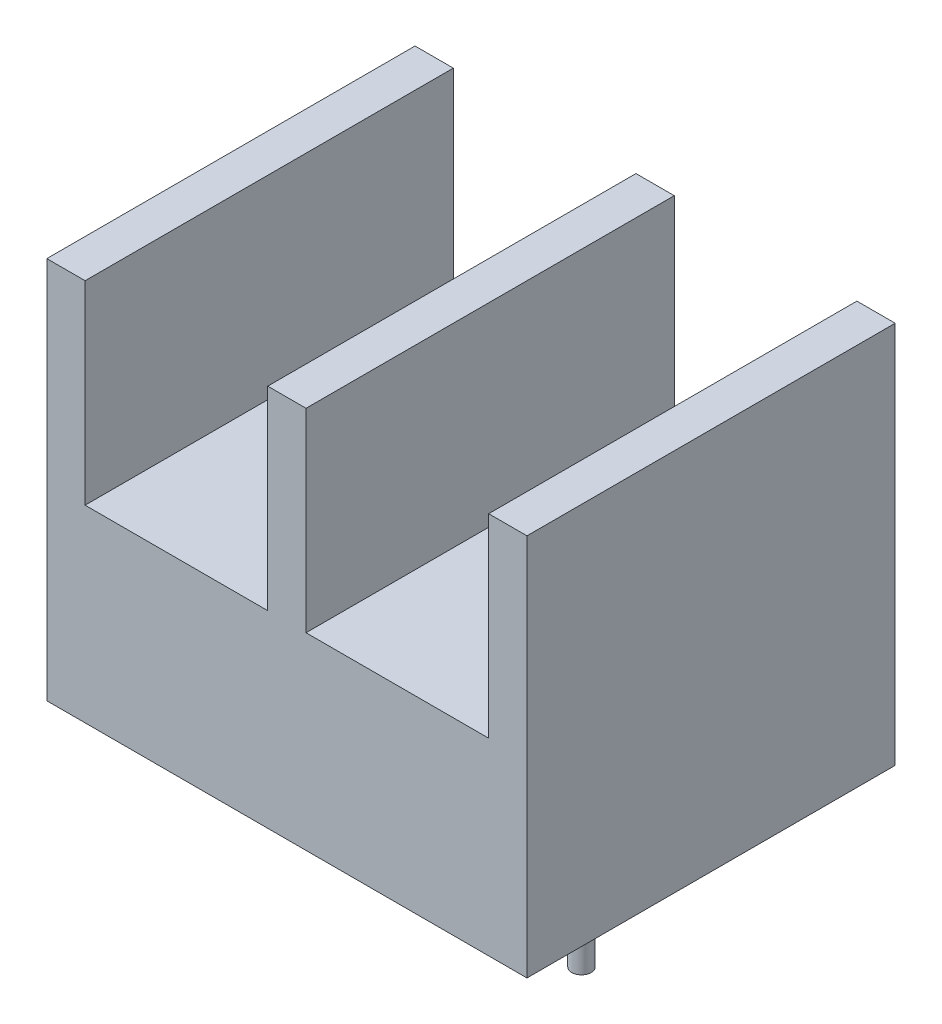
ISO-10303-21;
HEADER;
FILE_DESCRIPTION(('STEP AP214'),'2;1');
FILE_NAME('part.step','',(''),(''),'','','');
FILE_SCHEMA(('AUTOMOTIVE_DESIGN { 1 0 10303 214 1 1 1 1 }'));
ENDSEC;
DATA;
#1=APPLICATION_CONTEXT('core data for automotive mechanical design processes');
#2=APPLICATION_PROTOCOL_DEFINITION('international standard','automotive_design',2000,#1);
#3=PRODUCT_CONTEXT('',#1,'mechanical');
#4=PRODUCT('Part','Part','',(#3));
#5=PRODUCT_RELATED_PRODUCT_CATEGORY('part','',(#4));
#6=PRODUCT_DEFINITION_FORMATION('','',#4);
#7=PRODUCT_DEFINITION_CONTEXT('part definition',#1,'design');
#8=PRODUCT_DEFINITION('design','',#6,#7);
#9=PRODUCT_DEFINITION_SHAPE('','',#8);
#10=(LENGTH_UNIT() NAMED_UNIT(*) SI_UNIT(.MILLI.,.METRE.));
#11=(NAMED_UNIT(*) PLANE_ANGLE_UNIT() SI_UNIT($,.RADIAN.));
#12=(NAMED_UNIT(*) SI_UNIT($,.STERADIAN.) SOLID_ANGLE_UNIT());
#13=UNCERTAINTY_MEASURE_WITH_UNIT(LENGTH_MEASURE(1.E-05),#10,'distance_accuracy_value','');
#14=(GEOMETRIC_REPRESENTATION_CONTEXT(3) GLOBAL_UNCERTAINTY_ASSIGNED_CONTEXT((#13)) GLOBAL_UNIT_ASSIGNED_CONTEXT((#10,
#11,#12)) REPRESENTATION_CONTEXT('',''));
#15=CARTESIAN_POINT('',(0.,0.,0.));
#16=DIRECTION('',(0.,0.,1.));
#17=DIRECTION('',(1.,0.,0.));
#18=AXIS2_PLACEMENT_3D('',#15,#16,#17);
#19=CARTESIAN_POINT('',(0.,16.51,0.));
#20=DIRECTION('',(0.,-1.,0.));
#21=DIRECTION('',(0.,0.,-1.));
#22=AXIS2_PLACEMENT_3D('',#19,#20,#21);
#23=PLANE('',#22);
#24=DIRECTION('',(-1.,0.,0.));
#25=VECTOR('',#24,1.);
#26=CARTESIAN_POINT('',(-10.3505,16.51,-7.9375));
#27=LINE('',#26,#25);
#28=CARTESIAN_POINT('',(10.3505,16.51,-7.9375));
#29=VERTEX_POINT('',#28);
#30=CARTESIAN_POINT('',(8.69950000000003,16.51,-7.9375));
#31=VERTEX_POINT('',#30);
#32=EDGE_CURVE('E202',#29,#31,#27,.T.);
#33=ORIENTED_EDGE('',*,*,#32,.T.);
#34=DIRECTION('',(0.,0.,-1.));
#35=VECTOR('',#34,1.);
#36=CARTESIAN_POINT('',(8.69950000000003,16.51,7.9375));
#37=LINE('',#36,#35);
#38=CARTESIAN_POINT('',(8.69950000000003,16.51,7.9375));
#39=VERTEX_POINT('',#38);
#40=EDGE_CURVE('E156',#39,#31,#37,.T.);
#41=ORIENTED_EDGE('',*,*,#40,.F.);
#42=DIRECTION('',(1.,0.,0.));
#43=VECTOR('',#42,1.);
#44=CARTESIAN_POINT('',(-10.3505,16.51,7.9375));
#45=LINE('',#44,#43);
#46=CARTESIAN_POINT('',(10.3505,16.51,7.9375));
#47=VERTEX_POINT('',#46);
#48=EDGE_CURVE('E147',#39,#47,#45,.T.);
#49=ORIENTED_EDGE('',*,*,#48,.T.);
#50=DIRECTION('',(0.,0.,-1.));
#51=VECTOR('',#50,1.);
#52=CARTESIAN_POINT('',(10.3505,16.51,7.9375));
#53=LINE('',#52,#51);
#54=EDGE_CURVE('E197',#47,#29,#53,.T.);
#55=ORIENTED_EDGE('',*,*,#54,.T.);
#56=EDGE_LOOP('',(#33,#41,#49,#55));
#57=FACE_BOUND('',#56,.T.);
#58=ADVANCED_FACE('F35',(#57),#23,.F.);
#59=CARTESIAN_POINT('',(-0.825499999999989,16.51,7.9375));
#60=VERTEX_POINT('',#59);
#61=CARTESIAN_POINT('',(0.825499999999989,16.51,7.9375));
#62=VERTEX_POINT('',#61);
#63=EDGE_CURVE('E212',#60,#62,#45,.T.);
#64=ORIENTED_EDGE('',*,*,#63,.T.);
#65=DIRECTION('',(0.,0.,-1.));
#66=VECTOR('',#65,1.);
#67=CARTESIAN_POINT('',(0.825499999999989,16.51,7.9375));
#68=LINE('',#67,#66);
#69=CARTESIAN_POINT('',(0.825499999999989,16.51,-7.9375));
#70=VERTEX_POINT('',#69);
#71=EDGE_CURVE('E159',#62,#70,#68,.T.);
#72=ORIENTED_EDGE('',*,*,#71,.T.);
#73=CARTESIAN_POINT('',(-0.825499999999989,16.51,-7.9375));
#74=VERTEX_POINT('',#73);
#75=EDGE_CURVE('E206',#70,#74,#27,.T.);
#76=ORIENTED_EDGE('',*,*,#75,.T.);
#77=DIRECTION('',(0.,0.,-1.));
#78=VECTOR('',#77,1.);
#79=CARTESIAN_POINT('',(-0.825499999999989,16.51,7.9375));
#80=LINE('',#79,#78);
#81=EDGE_CURVE('E154',#60,#74,#80,.T.);
#82=ORIENTED_EDGE('',*,*,#81,.F.);
#83=EDGE_LOOP('',(#64,#72,#76,#82));
#84=FACE_BOUND('',#83,.T.);
#85=ADVANCED_FACE('F246',(#84),#23,.F.);
#86=CARTESIAN_POINT('',(10.3505,16.51,7.9375));
#87=DIRECTION('',(-1.,0.,0.));
#88=DIRECTION('',(0.,0.,1.));
#89=AXIS2_PLACEMENT_3D('',#86,#87,#88);
#90=PLANE('',#89);
#91=DIRECTION('',(0.,0.,-1.));
#92=VECTOR('',#91,1.);
#93=CARTESIAN_POINT('',(10.3505,0.,7.9375));
#94=LINE('',#93,#92);
#95=CARTESIAN_POINT('',(10.3505,0.,7.9375));
#96=VERTEX_POINT('',#95);
#97=CARTESIAN_POINT('',(10.3505,0.,-7.9375));
#98=VERTEX_POINT('',#97);
#99=EDGE_CURVE('E194',#96,#98,#94,.T.);
#100=ORIENTED_EDGE('',*,*,#99,.T.);
#101=DIRECTION('',(0.,-1.,0.));
#102=VECTOR('',#101,1.);
#103=CARTESIAN_POINT('',(10.3505,16.51,-7.9375));
#104=LINE('',#103,#102);
#105=EDGE_CURVE('E11',#29,#98,#104,.T.);
#106=ORIENTED_EDGE('',*,*,#105,.F.);
#107=ORIENTED_EDGE('',*,*,#54,.F.);
#108=DIRECTION('',(0.,-1.,0.));
#109=VECTOR('',#108,1.);
#110=CARTESIAN_POINT('',(10.3505,16.51,7.9375));
#111=LINE('',#110,#109);
#112=EDGE_CURVE('E211',#47,#96,#111,.T.);
#113=ORIENTED_EDGE('',*,*,#112,.T.);
#114=EDGE_LOOP('',(#100,#106,#107,#113));
#115=FACE_BOUND('',#114,.T.);
#116=ADVANCED_FACE('F37',(#115),#90,.F.);
#117=CARTESIAN_POINT('',(-10.3505,16.51,-7.9375));
#118=DIRECTION('',(0.,0.,1.));
#119=DIRECTION('',(1.,0.,0.));
#120=AXIS2_PLACEMENT_3D('',#117,#118,#119);
#121=PLANE('',#120);
#122=DIRECTION('',(-1.,0.,0.));
#123=VECTOR('',#122,1.);
#124=CARTESIAN_POINT('',(8.69950000000002,8.128,-7.9375));
#125=LINE('',#124,#123);
#126=CARTESIAN_POINT('',(8.69950000000002,8.128,-7.9375));
#127=VERTEX_POINT('',#126);
#128=CARTESIAN_POINT('',(0.825499999999991,8.12800000000001,-7.9375));
#129=VERTEX_POINT('',#128);
#130=EDGE_CURVE('E149',#127,#129,#125,.T.);
#131=ORIENTED_EDGE('',*,*,#130,.F.);
#132=DIRECTION('',(0.,-1.,0.));
#133=VECTOR('',#132,1.);
#134=CARTESIAN_POINT('',(8.69950000000003,16.51,-7.9375));
#135=LINE('',#134,#133);
#136=EDGE_CURVE('E130',#31,#127,#135,.T.);
#137=ORIENTED_EDGE('',*,*,#136,.F.);
#138=ORIENTED_EDGE('',*,*,#32,.F.);
#139=ORIENTED_EDGE('',*,*,#105,.T.);
#140=DIRECTION('',(-1.,0.,0.));
#141=VECTOR('',#140,1.);
#142=CARTESIAN_POINT('',(-10.3505,0.,-7.9375));
#143=LINE('',#142,#141);
#144=CARTESIAN_POINT('',(-10.3505,0.,-7.9375));
#145=VERTEX_POINT('',#144);
#146=EDGE_CURVE('E215',#98,#145,#143,.T.);
#147=ORIENTED_EDGE('',*,*,#146,.T.);
#148=DIRECTION('',(0.,-1.,0.));
#149=VECTOR('',#148,1.);
#150=CARTESIAN_POINT('',(-10.3505,16.51,-7.9375));
#151=LINE('',#150,#149);
#152=CARTESIAN_POINT('',(-10.3505,16.51,-7.9375));
#153=VERTEX_POINT('',#152);
#154=EDGE_CURVE('E43',#153,#145,#151,.T.);
#155=ORIENTED_EDGE('',*,*,#154,.F.);
#156=CARTESIAN_POINT('',(-8.69949999999999,16.51,-7.9375));
#157=VERTEX_POINT('',#156);
#158=EDGE_CURVE('E200',#157,#153,#27,.T.);
#159=ORIENTED_EDGE('',*,*,#158,.F.);
#160=DIRECTION('',(0.,1.,0.));
#161=VECTOR('',#160,1.);
#162=CARTESIAN_POINT('',(-8.69949999999999,16.51,-7.9375));
#163=LINE('',#162,#161);
#164=CARTESIAN_POINT('',(-8.69949999999999,8.128,-7.9375));
#165=VERTEX_POINT('',#164);
#166=EDGE_CURVE('E50',#165,#157,#163,.T.);
#167=ORIENTED_EDGE('',*,*,#166,.F.);
#168=DIRECTION('',(-1.,0.,0.));
#169=VECTOR('',#168,1.);
#170=CARTESIAN_POINT('',(-0.825499999999993,8.12800000000001,-7.9375));
#171=LINE('',#170,#169);
#172=CARTESIAN_POINT('',(-0.825499999999993,8.12800000000001,-7.9375));
#173=VERTEX_POINT('',#172);
#174=EDGE_CURVE('E175',#173,#165,#171,.T.);
#175=ORIENTED_EDGE('',*,*,#174,.F.);
#176=DIRECTION('',(0.,-1.,0.));
#177=VECTOR('',#176,1.);
#178=CARTESIAN_POINT('',(-0.825499999999989,16.51,-7.9375));
#179=LINE('',#178,#177);
#180=EDGE_CURVE('E172',#74,#173,#179,.T.);
#181=ORIENTED_EDGE('',*,*,#180,.F.);
#182=ORIENTED_EDGE('',*,*,#75,.F.);
#183=DIRECTION('',(0.,1.,0.));
#184=VECTOR('',#183,1.);
#185=CARTESIAN_POINT('',(0.825499999999989,16.51,-7.9375));
#186=LINE('',#185,#184);
#187=EDGE_CURVE('E58',#129,#70,#186,.T.);
#188=ORIENTED_EDGE('',*,*,#187,.F.);
#189=EDGE_LOOP('',(#131,#137,#138,#139,#147,#155,#159,#167,#175,#181,#182,#188));
#190=FACE_BOUND('',#189,.T.);
#191=ADVANCED_FACE('F250',(#190),#121,.F.);
#192=CARTESIAN_POINT('',(-10.3505,16.51,7.9375));
#193=DIRECTION('',(1.,0.,0.));
#194=DIRECTION('',(0.,0.,-1.));
#195=AXIS2_PLACEMENT_3D('',#192,#193,#194);
#196=PLANE('',#195);
#197=DIRECTION('',(0.,0.,1.));
#198=VECTOR('',#197,1.);
#199=CARTESIAN_POINT('',(-10.3505,0.,7.9375));
#200=LINE('',#199,#198);
#201=CARTESIAN_POINT('',(-10.3505,0.,7.9375));
#202=VERTEX_POINT('',#201);
#203=EDGE_CURVE('E217',#145,#202,#200,.T.);
#204=ORIENTED_EDGE('',*,*,#203,.T.);
#205=DIRECTION('',(0.,-1.,0.));
#206=VECTOR('',#205,1.);
#207=CARTESIAN_POINT('',(-10.3505,16.51,7.9375));
#208=LINE('',#207,#206);
#209=CARTESIAN_POINT('',(-10.3505,16.51,7.9375));
#210=VERTEX_POINT('',#209);
#211=EDGE_CURVE('E222',#210,#202,#208,.T.);
#212=ORIENTED_EDGE('',*,*,#211,.F.);
#213=DIRECTION('',(0.,0.,1.));
#214=VECTOR('',#213,1.);
#215=CARTESIAN_POINT('',(-10.3505,16.51,7.9375));
#216=LINE('',#215,#214);
#217=EDGE_CURVE('E205',#153,#210,#216,.T.);
#218=ORIENTED_EDGE('',*,*,#217,.F.);
#219=ORIENTED_EDGE('',*,*,#154,.T.);
#220=EDGE_LOOP('',(#204,#212,#218,#219));
#221=FACE_BOUND('',#220,.T.);
#222=ADVANCED_FACE('F229',(#221),#196,.F.);
#223=CARTESIAN_POINT('',(-10.3505,16.51,7.9375));
#224=DIRECTION('',(0.,0.,-1.));
#225=DIRECTION('',(-1.,0.,0.));
#226=AXIS2_PLACEMENT_3D('',#223,#224,#225);
#227=PLANE('',#226);
#228=ORIENTED_EDGE('',*,*,#48,.F.);
#229=DIRECTION('',(0.,-1.,0.));
#230=VECTOR('',#229,1.);
#231=CARTESIAN_POINT('',(8.69950000000003,16.51,7.9375));
#232=LINE('',#231,#230);
#233=CARTESIAN_POINT('',(8.69950000000002,8.128,7.9375));
#234=VERTEX_POINT('',#233);
#235=EDGE_CURVE('E127',#39,#234,#232,.T.);
#236=ORIENTED_EDGE('',*,*,#235,.T.);
#237=DIRECTION('',(-1.,0.,0.));
#238=VECTOR('',#237,1.);
#239=CARTESIAN_POINT('',(8.69950000000002,8.128,7.9375));
#240=LINE('',#239,#238);
#241=CARTESIAN_POINT('',(0.825499999999991,8.12800000000001,7.9375));
#242=VERTEX_POINT('',#241);
#243=EDGE_CURVE('E138',#234,#242,#240,.T.);
#244=ORIENTED_EDGE('',*,*,#243,.T.);
#245=DIRECTION('',(0.,1.,0.));
#246=VECTOR('',#245,1.);
#247=CARTESIAN_POINT('',(0.825499999999989,16.51,7.9375));
#248=LINE('',#247,#246);
#249=EDGE_CURVE('E135',#242,#62,#248,.T.);
#250=ORIENTED_EDGE('',*,*,#249,.T.);
#251=ORIENTED_EDGE('',*,*,#63,.F.);
#252=DIRECTION('',(0.,-1.,0.));
#253=VECTOR('',#252,1.);
#254=CARTESIAN_POINT('',(-0.825499999999989,16.51,7.9375));
#255=LINE('',#254,#253);
#256=CARTESIAN_POINT('',(-0.825499999999993,8.12800000000001,7.9375));
#257=VERTEX_POINT('',#256);
#258=EDGE_CURVE('E162',#60,#257,#255,.T.);
#259=ORIENTED_EDGE('',*,*,#258,.T.);
#260=DIRECTION('',(-1.,0.,0.));
#261=VECTOR('',#260,1.);
#262=CARTESIAN_POINT('',(-0.825499999999993,8.12800000000001,7.9375));
#263=LINE('',#262,#261);
#264=CARTESIAN_POINT('',(-8.69949999999999,8.128,7.9375));
#265=VERTEX_POINT('',#264);
#266=EDGE_CURVE('E165',#257,#265,#263,.T.);
#267=ORIENTED_EDGE('',*,*,#266,.T.);
#268=DIRECTION('',(0.,1.,0.));
#269=VECTOR('',#268,1.);
#270=CARTESIAN_POINT('',(-8.69949999999999,16.51,7.9375));
#271=LINE('',#270,#269);
#272=CARTESIAN_POINT('',(-8.69949999999999,16.51,7.9375));
#273=VERTEX_POINT('',#272);
#274=EDGE_CURVE('E168',#265,#273,#271,.T.);
#275=ORIENTED_EDGE('',*,*,#274,.T.);
#276=EDGE_CURVE('E208',#210,#273,#45,.T.);
#277=ORIENTED_EDGE('',*,*,#276,.F.);
#278=ORIENTED_EDGE('',*,*,#211,.T.);
#279=DIRECTION('',(1.,0.,0.));
#280=VECTOR('',#279,1.);
#281=CARTESIAN_POINT('',(-10.3505,0.,7.9375));
#282=LINE('',#281,#280);
#283=EDGE_CURVE('E201',#202,#96,#282,.T.);
#284=ORIENTED_EDGE('',*,*,#283,.T.);
#285=ORIENTED_EDGE('',*,*,#112,.F.);
#286=EDGE_LOOP('',(#228,#236,#244,#250,#251,#259,#267,#275,#277,#278,#284,#285));
#287=FACE_BOUND('',#286,.T.);
#288=ADVANCED_FACE('F145',(#287),#227,.F.);
#289=ORIENTED_EDGE('',*,*,#276,.T.);
#290=DIRECTION('',(0.,0.,-1.));
#291=VECTOR('',#290,1.);
#292=CARTESIAN_POINT('',(-8.69949999999999,16.51,7.9375));
#293=LINE('',#292,#291);
#294=EDGE_CURVE('E180',#273,#157,#293,.T.);
#295=ORIENTED_EDGE('',*,*,#294,.T.);
#296=ORIENTED_EDGE('',*,*,#158,.T.);
#297=ORIENTED_EDGE('',*,*,#217,.T.);
#298=EDGE_LOOP('',(#289,#295,#296,#297));
#299=FACE_BOUND('',#298,.T.);
#300=ADVANCED_FACE('F254',(#299),#23,.F.);
#301=CARTESIAN_POINT('',(0.,0.,0.));
#302=DIRECTION('',(0.,-1.,0.));
#303=DIRECTION('',(0.,0.,-1.));
#304=AXIS2_PLACEMENT_3D('',#301,#302,#303);
#305=PLANE('',#304);
#306=CARTESIAN_POINT('',(-4.7625,0.,0.));
#307=DIRECTION('',(0.,-1.,0.));
#308=DIRECTION('',(0.,0.,-1.));
#309=AXIS2_PLACEMENT_3D('',#306,#307,#308);
#310=CIRCLE('',#309,0.4191);
#311=CARTESIAN_POINT('',(-4.7625,0.,-0.4191));
#312=VERTEX_POINT('',#311);
#313=EDGE_CURVE('E158',#312,#312,#310,.T.);
#314=ORIENTED_EDGE('',*,*,#313,.F.);
#315=EDGE_LOOP('',(#314));
#316=FACE_BOUND('',#315,.T.);
#317=CARTESIAN_POINT('',(4.7625,0.,0.));
#318=DIRECTION('',(0.,-1.,0.));
#319=DIRECTION('',(0.,0.,-1.));
#320=AXIS2_PLACEMENT_3D('',#317,#318,#319);
#321=CIRCLE('',#320,0.4191);
#322=CARTESIAN_POINT('',(4.7625,0.,-0.4191));
#323=VERTEX_POINT('',#322);
#324=EDGE_CURVE('E188',#323,#323,#321,.T.);
#325=ORIENTED_EDGE('',*,*,#324,.F.);
#326=EDGE_LOOP('',(#325));
#327=FACE_BOUND('',#326,.T.);
#328=ORIENTED_EDGE('',*,*,#99,.F.);
#329=ORIENTED_EDGE('',*,*,#283,.F.);
#330=ORIENTED_EDGE('',*,*,#203,.F.);
#331=ORIENTED_EDGE('',*,*,#146,.F.);
#332=EDGE_LOOP('',(#328,#329,#330,#331));
#333=FACE_BOUND('',#332,.T.);
#334=ADVANCED_FACE('F236',(#316,#327,#333),#305,.T.);
#335=CARTESIAN_POINT('',(4.7625,-6.35,0.));
#336=DIRECTION('',(0.,1.,0.));
#337=DIRECTION('',(0.,0.,1.));
#338=AXIS2_PLACEMENT_3D('',#335,#336,#337);
#339=CYLINDRICAL_SURFACE('',#338,0.4191);
#340=CARTESIAN_POINT('',(4.7625,-6.35,0.));
#341=DIRECTION('',(0.,-1.,0.));
#342=DIRECTION('',(0.,0.,-1.));
#343=AXIS2_PLACEMENT_3D('',#340,#341,#342);
#344=CIRCLE('',#343,0.4191);
#345=CARTESIAN_POINT('',(4.7625,-6.35,-0.4191));
#346=VERTEX_POINT('',#345);
#347=EDGE_CURVE('E191',#346,#346,#344,.T.);
#348=ORIENTED_EDGE('',*,*,#347,.F.);
#349=EDGE_LOOP('',(#348));
#350=FACE_BOUND('',#349,.T.);
#351=ORIENTED_EDGE('',*,*,#324,.T.);
#352=EDGE_LOOP('',(#351));
#353=FACE_BOUND('',#352,.T.);
#354=ADVANCED_FACE('F287',(#350,#353),#339,.T.);
#355=CARTESIAN_POINT('',(0.,-6.35,0.));
#356=DIRECTION('',(0.,-1.,0.));
#357=DIRECTION('',(0.,0.,-1.));
#358=AXIS2_PLACEMENT_3D('',#355,#356,#357);
#359=PLANE('',#358);
#360=ORIENTED_EDGE('',*,*,#347,.T.);
#361=EDGE_LOOP('',(#360));
#362=FACE_BOUND('',#361,.T.);
#363=ADVANCED_FACE('F326',(#362),#359,.T.);
#364=CARTESIAN_POINT('',(-4.7625,-6.35,0.));
#365=DIRECTION('',(0.,1.,0.));
#366=DIRECTION('',(0.,0.,1.));
#367=AXIS2_PLACEMENT_3D('',#364,#365,#366);
#368=CYLINDRICAL_SURFACE('',#367,0.4191);
#369=CARTESIAN_POINT('',(-4.7625,-6.35,0.));
#370=DIRECTION('',(0.,-1.,0.));
#371=DIRECTION('',(0.,0.,-1.));
#372=AXIS2_PLACEMENT_3D('',#369,#370,#371);
#373=CIRCLE('',#372,0.4191);
#374=CARTESIAN_POINT('',(-4.7625,-6.35,-0.4191));
#375=VERTEX_POINT('',#374);
#376=EDGE_CURVE('E185',#375,#375,#373,.T.);
#377=ORIENTED_EDGE('',*,*,#376,.F.);
#378=EDGE_LOOP('',(#377));
#379=FACE_BOUND('',#378,.T.);
#380=ORIENTED_EDGE('',*,*,#313,.T.);
#381=EDGE_LOOP('',(#380));
#382=FACE_BOUND('',#381,.T.);
#383=ADVANCED_FACE('F271',(#379,#382),#368,.T.);
#384=CARTESIAN_POINT('',(0.,-6.35,0.));
#385=DIRECTION('',(0.,-1.,0.));
#386=DIRECTION('',(0.,0.,-1.));
#387=AXIS2_PLACEMENT_3D('',#384,#385,#386);
#388=PLANE('',#387);
#389=ORIENTED_EDGE('',*,*,#376,.T.);
#390=EDGE_LOOP('',(#389));
#391=FACE_BOUND('',#390,.T.);
#392=ADVANCED_FACE('F263',(#391),#388,.T.);
#393=CARTESIAN_POINT('',(-0.825499999999989,16.51,7.9375));
#394=DIRECTION('',(1.,0.,0.));
#395=DIRECTION('',(0.,1.,0.));
#396=AXIS2_PLACEMENT_3D('',#393,#394,#395);
#397=PLANE('',#396);
#398=ORIENTED_EDGE('',*,*,#180,.T.);
#399=DIRECTION('',(0.,0.,-1.));
#400=VECTOR('',#399,1.);
#401=CARTESIAN_POINT('',(-0.825499999999993,8.12800000000001,7.9375));
#402=LINE('',#401,#400);
#403=EDGE_CURVE('E171',#257,#173,#402,.T.);
#404=ORIENTED_EDGE('',*,*,#403,.F.);
#405=ORIENTED_EDGE('',*,*,#258,.F.);
#406=ORIENTED_EDGE('',*,*,#81,.T.);
#407=EDGE_LOOP('',(#398,#404,#405,#406));
#408=FACE_BOUND('',#407,.T.);
#409=ADVANCED_FACE('F260',(#408),#397,.F.);
#410=CARTESIAN_POINT('',(-8.69949999999999,16.51,7.9375));
#411=DIRECTION('',(-1.,0.,0.));
#412=DIRECTION('',(0.,0.,1.));
#413=AXIS2_PLACEMENT_3D('',#410,#411,#412);
#414=PLANE('',#413);
#415=ORIENTED_EDGE('',*,*,#166,.T.);
#416=ORIENTED_EDGE('',*,*,#294,.F.);
#417=ORIENTED_EDGE('',*,*,#274,.F.);
#418=DIRECTION('',(0.,0.,-1.));
#419=VECTOR('',#418,1.);
#420=CARTESIAN_POINT('',(-8.69949999999999,8.128,7.9375));
#421=LINE('',#420,#419);
#422=EDGE_CURVE('E182',#265,#165,#421,.T.);
#423=ORIENTED_EDGE('',*,*,#422,.T.);
#424=EDGE_LOOP('',(#415,#416,#417,#423));
#425=FACE_BOUND('',#424,.T.);
#426=ADVANCED_FACE('F262',(#425),#414,.F.);
#427=CARTESIAN_POINT('',(-0.825499999999993,8.12800000000001,7.9375));
#428=DIRECTION('',(0.,-1.,0.));
#429=DIRECTION('',(1.,0.,0.));
#430=AXIS2_PLACEMENT_3D('',#427,#428,#429);
#431=PLANE('',#430);
#432=ORIENTED_EDGE('',*,*,#174,.T.);
#433=ORIENTED_EDGE('',*,*,#422,.F.);
#434=ORIENTED_EDGE('',*,*,#266,.F.);
#435=ORIENTED_EDGE('',*,*,#403,.T.);
#436=EDGE_LOOP('',(#432,#433,#434,#435));
#437=FACE_BOUND('',#436,.T.);
#438=ADVANCED_FACE('F256',(#437),#431,.F.);
#439=CARTESIAN_POINT('',(8.69950000000003,16.51,7.9375));
#440=DIRECTION('',(1.,0.,0.));
#441=DIRECTION('',(0.,1.,0.));
#442=AXIS2_PLACEMENT_3D('',#439,#440,#441);
#443=PLANE('',#442);
#444=ORIENTED_EDGE('',*,*,#136,.T.);
#445=DIRECTION('',(0.,0.,-1.));
#446=VECTOR('',#445,1.);
#447=CARTESIAN_POINT('',(8.69950000000002,8.128,7.9375));
#448=LINE('',#447,#446);
#449=EDGE_CURVE('E123',#234,#127,#448,.T.);
#450=ORIENTED_EDGE('',*,*,#449,.F.);
#451=ORIENTED_EDGE('',*,*,#235,.F.);
#452=ORIENTED_EDGE('',*,*,#40,.T.);
#453=EDGE_LOOP('',(#444,#450,#451,#452));
#454=FACE_BOUND('',#453,.T.);
#455=ADVANCED_FACE('F125',(#454),#443,.F.);
#456=CARTESIAN_POINT('',(0.825499999999989,16.51,7.9375));
#457=DIRECTION('',(-1.,0.,0.));
#458=DIRECTION('',(0.,-1.,0.));
#459=AXIS2_PLACEMENT_3D('',#456,#457,#458);
#460=PLANE('',#459);
#461=ORIENTED_EDGE('',*,*,#187,.T.);
#462=ORIENTED_EDGE('',*,*,#71,.F.);
#463=ORIENTED_EDGE('',*,*,#249,.F.);
#464=DIRECTION('',(0.,0.,-1.));
#465=VECTOR('',#464,1.);
#466=CARTESIAN_POINT('',(0.825499999999991,8.12800000000001,7.9375));
#467=LINE('',#466,#465);
#468=EDGE_CURVE('E134',#242,#129,#467,.T.);
#469=ORIENTED_EDGE('',*,*,#468,.T.);
#470=EDGE_LOOP('',(#461,#462,#463,#469));
#471=FACE_BOUND('',#470,.T.);
#472=ADVANCED_FACE('F249',(#471),#460,.F.);
#473=CARTESIAN_POINT('',(8.69950000000002,8.128,7.9375));
#474=DIRECTION('',(0.,-1.,0.));
#475=DIRECTION('',(1.,0.,0.));
#476=AXIS2_PLACEMENT_3D('',#473,#474,#475);
#477=PLANE('',#476);
#478=ORIENTED_EDGE('',*,*,#130,.T.);
#479=ORIENTED_EDGE('',*,*,#468,.F.);
#480=ORIENTED_EDGE('',*,*,#243,.F.);
#481=ORIENTED_EDGE('',*,*,#449,.T.);
#482=EDGE_LOOP('',(#478,#479,#480,#481));
#483=FACE_BOUND('',#482,.T.);
#484=ADVANCED_FACE('F139',(#483),#477,.F.);
#485=CLOSED_SHELL('',(#58,#85,#116,#191,#222,#288,#300,#334,#354,#363,#383,#392,#409,#426,#438,
#455,#472,#484));
#486=MANIFOLD_SOLID_BREP('B2',#485);
#487=ADVANCED_BREP_SHAPE_REPRESENTATION('',(#18,#486),#14);
#488=SHAPE_DEFINITION_REPRESENTATION(#9,#487);
ENDSEC;
END-ISO-10303-21;
